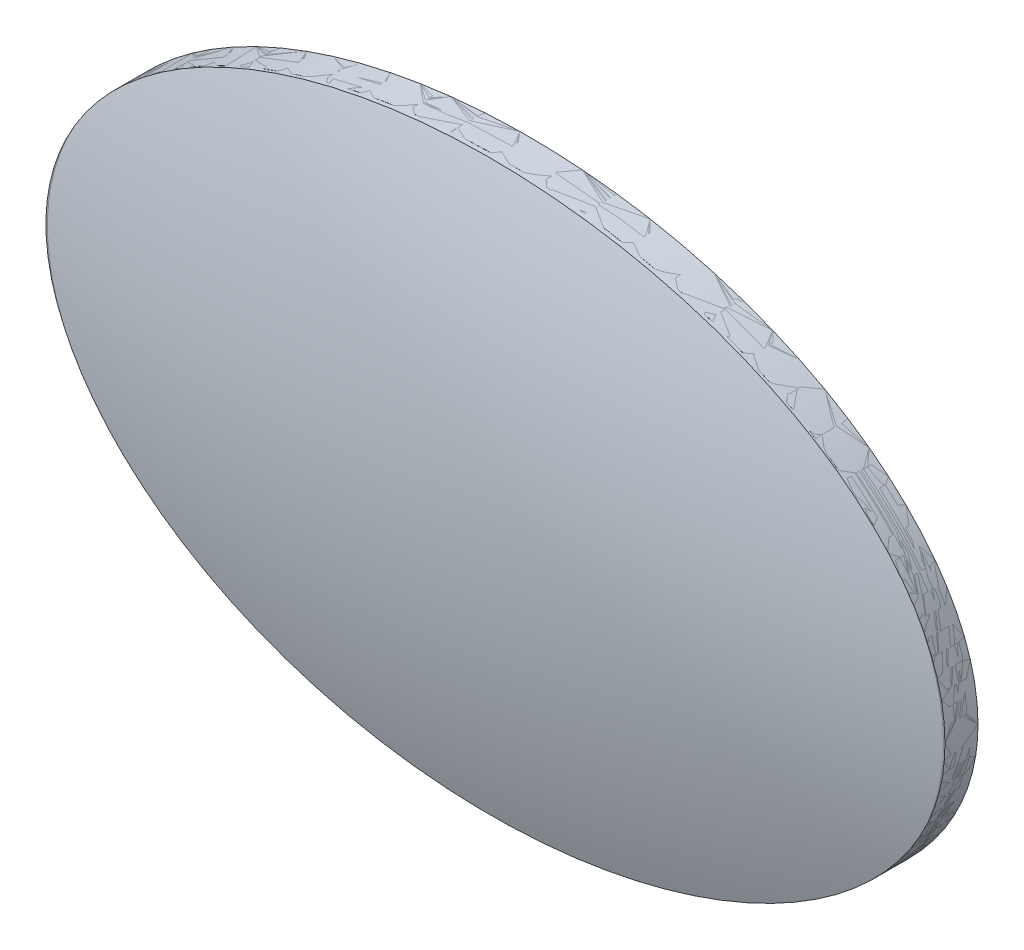
ISO-10303-21;
HEADER;
FILE_DESCRIPTION(('STEP AP214'),'2;1');
FILE_NAME('part.step','',(''),(''),'','','');
FILE_SCHEMA(('AUTOMOTIVE_DESIGN { 1 0 10303 214 1 1 1 1 }'));
ENDSEC;
DATA;
#1=APPLICATION_CONTEXT('core data for automotive mechanical design processes');
#2=APPLICATION_PROTOCOL_DEFINITION('international standard','automotive_design',2000,#1);
#3=PRODUCT_CONTEXT('',#1,'mechanical');
#4=PRODUCT('Part','Part','',(#3));
#5=PRODUCT_RELATED_PRODUCT_CATEGORY('part','',(#4));
#6=PRODUCT_DEFINITION_FORMATION('','',#4);
#7=PRODUCT_DEFINITION_CONTEXT('part definition',#1,'design');
#8=PRODUCT_DEFINITION('design','',#6,#7);
#9=PRODUCT_DEFINITION_SHAPE('','',#8);
#10=(LENGTH_UNIT() NAMED_UNIT(*) SI_UNIT(.MILLI.,.METRE.));
#11=(NAMED_UNIT(*) PLANE_ANGLE_UNIT() SI_UNIT($,.RADIAN.));
#12=(NAMED_UNIT(*) SI_UNIT($,.STERADIAN.) SOLID_ANGLE_UNIT());
#13=UNCERTAINTY_MEASURE_WITH_UNIT(LENGTH_MEASURE(1.E-05),#10,'distance_accuracy_value','');
#14=(GEOMETRIC_REPRESENTATION_CONTEXT(3) GLOBAL_UNCERTAINTY_ASSIGNED_CONTEXT((#13)) GLOBAL_UNIT_ASSIGNED_CONTEXT((#10,
#11,#12)) REPRESENTATION_CONTEXT('',''));
#15=CARTESIAN_POINT('',(0.,0.,0.));
#16=DIRECTION('',(0.,0.,1.));
#17=DIRECTION('',(1.,0.,0.));
#18=AXIS2_PLACEMENT_3D('',#15,#16,#17);
#19=CARTESIAN_POINT('',(0.,0.,0.));
#20=DIRECTION('',(0.,0.,1.));
#21=DIRECTION('',(1.,0.,0.));
#22=AXIS2_PLACEMENT_3D('',#19,#20,#21);
#23=PLANE('',#22);
#24=CARTESIAN_POINT('',(10.2557748774152,12.5325273636408,0.));
#25=DIRECTION('',(0.,0.,-1.));
#26=DIRECTION('',(1.,0.,0.));
#27=AXIS2_PLACEMENT_3D('',#24,#25,#26);
#28=CIRCLE('',#27,4.25000000000001);
#29=CARTESIAN_POINT('',(14.5057748774152,12.5325273636408,0.));
#30=VERTEX_POINT('',#29);
#31=EDGE_CURVE('E102',#30,#30,#28,.T.);
#32=ORIENTED_EDGE('',*,*,#31,.F.);
#33=EDGE_LOOP('',(#32));
#34=FACE_BOUND('',#33,.T.);
#35=CARTESIAN_POINT('',(10.2557748774152,-12.5325273636408,0.));
#36=DIRECTION('',(0.,0.,-1.));
#37=DIRECTION('',(1.,0.,0.));
#38=AXIS2_PLACEMENT_3D('',#35,#36,#37);
#39=CIRCLE('',#38,4.25000000000001);
#40=CARTESIAN_POINT('',(14.5057748774152,-12.5325273636408,0.));
#41=VERTEX_POINT('',#40);
#42=EDGE_CURVE('E106',#41,#41,#39,.T.);
#43=ORIENTED_EDGE('',*,*,#42,.F.);
#44=EDGE_LOOP('',(#43));
#45=FACE_BOUND('',#44,.T.);
#46=CARTESIAN_POINT('',(-10.2557748774152,-12.5325273636408,0.));
#47=DIRECTION('',(0.,0.,-1.));
#48=DIRECTION('',(-1.,0.,0.));
#49=AXIS2_PLACEMENT_3D('',#46,#47,#48);
#50=CIRCLE('',#49,4.25000000000001);
#51=CARTESIAN_POINT('',(-14.5057748774152,-12.5325273636408,0.));
#52=VERTEX_POINT('',#51);
#53=EDGE_CURVE('E110',#52,#52,#50,.T.);
#54=ORIENTED_EDGE('',*,*,#53,.F.);
#55=EDGE_LOOP('',(#54));
#56=FACE_BOUND('',#55,.T.);
#57=CARTESIAN_POINT('',(-10.2557748774152,12.5325273636408,0.));
#58=DIRECTION('',(0.,0.,-1.));
#59=DIRECTION('',(-1.,0.,0.));
#60=AXIS2_PLACEMENT_3D('',#57,#58,#59);
#61=CIRCLE('',#60,4.25000000000001);
#62=CARTESIAN_POINT('',(-14.5057748774152,12.5325273636408,0.));
#63=VERTEX_POINT('',#62);
#64=EDGE_CURVE('E81',#63,#63,#61,.T.);
#65=ORIENTED_EDGE('',*,*,#64,.F.);
#66=EDGE_LOOP('',(#65));
#67=FACE_BOUND('',#66,.T.);
#68=CARTESIAN_POINT('',(43.18,0.,-1.11022302462516E-13));
#69=CARTESIAN_POINT('',(43.18,3.4878693715103,-1.11022302462516E-13));
#70=CARTESIAN_POINT('',(41.0430846800186,10.4636081145309,-1.11022302462516E-13));
#71=CARTESIAN_POINT('',(31.5723963181923,19.6293858358663,-1.11022302462516E-13));
#72=CARTESIAN_POINT('',(17.1321357438557,25.842526194068,-1.11022302462516E-13));
#73=CARTESIAN_POINT('',(0.,28.036236902966,-1.11022302462516E-13));
#74=CARTESIAN_POINT('',(-17.1321357438557,25.842526194068,-1.11022302462516E-13));
#75=CARTESIAN_POINT('',(-31.5723963181923,19.6293858358664,-1.11022302462516E-13));
#76=CARTESIAN_POINT('',(-41.0430846800186,10.4636081145309,-1.11022302462516E-13));
#77=CARTESIAN_POINT('',(-44.2484576599907,0.,-1.11022302462516E-13));
#78=CARTESIAN_POINT('',(-41.0430846800186,-10.4636081145309,-1.11022302462516E-13));
#79=CARTESIAN_POINT('',(-31.5723963181923,-19.6293858358663,-1.11022302462516E-13));
#80=CARTESIAN_POINT('',(-17.1321357438557,-25.842526194068,-1.11022302462516E-13));
#81=CARTESIAN_POINT('',(0.,-28.036236902966,-1.11022302462516E-13));
#82=CARTESIAN_POINT('',(17.1321357438557,-25.842526194068,-1.11022302462516E-13));
#83=CARTESIAN_POINT('',(31.5723963181923,-19.6293858358664,-1.11022302462516E-13));
#84=CARTESIAN_POINT('',(41.0430846800186,-10.4636081145309,-1.11022302462516E-13));
#85=CARTESIAN_POINT('',(43.18,-3.48786937151031,-1.11022302462516E-13));
#86=CARTESIAN_POINT('',(43.18,0.,-1.11022302462516E-13));
#87=B_SPLINE_CURVE_WITH_KNOTS('',3,(#68,#69,#70,#71,#72,#73,#74,#75,#76,#77,#78,#79,#80,#81,#82,
#83,#84,#85,#86),.UNSPECIFIED.,.T.,.F.,(4,1,1,1,1,1,1,1,1,1,1,1,1,1,1,1,4),(0.,
0.392699081698724,0.785398163397448,1.17809724509617,1.5707963267949,1.96349540849362,
2.35619449019234,2.74889357189107,3.14159265358979,3.53429173528852,3.92699081698724,
4.31968989868597,4.71238898038469,5.10508806208341,5.49778714378214,5.89048622548086,
6.28318530717959),.UNSPECIFIED.);
#88=CARTESIAN_POINT('',(43.18,0.,-1.11022302462516E-13));
#89=VERTEX_POINT('',#88);
#90=EDGE_CURVE('E11',#89,#89,#87,.F.);
#91=ORIENTED_EDGE('',*,*,#90,.T.);
#92=EDGE_LOOP('',(#91));
#93=FACE_BOUND('',#92,.T.);
#94=ADVANCED_FACE('F47',(#34,#45,#56,#67,#93),#23,.F.);
#95=CARTESIAN_POINT('',(43.18,0.,524.129));
#96=CARTESIAN_POINT('',(43.18,3.4878693715103,524.129));
#97=CARTESIAN_POINT('',(41.0430846800186,10.4636081145309,524.129));
#98=CARTESIAN_POINT('',(31.5723963181923,19.6293858358663,524.129));
#99=CARTESIAN_POINT('',(17.1321357438557,25.842526194068,524.129));
#100=CARTESIAN_POINT('',(0.,28.036236902966,524.129));
#101=CARTESIAN_POINT('',(-17.1321357438557,25.842526194068,524.129));
#102=CARTESIAN_POINT('',(-31.5723963181923,19.6293858358664,524.129));
#103=CARTESIAN_POINT('',(-41.0430846800186,10.4636081145309,524.129));
#104=CARTESIAN_POINT('',(-44.2484576599907,0.,524.129));
#105=CARTESIAN_POINT('',(-41.0430846800186,-10.4636081145309,524.129));
#106=CARTESIAN_POINT('',(-31.5723963181923,-19.6293858358663,524.129));
#107=CARTESIAN_POINT('',(-17.1321357438557,-25.842526194068,524.129));
#108=CARTESIAN_POINT('',(0.,-28.036236902966,524.129));
#109=CARTESIAN_POINT('',(17.1321357438557,-25.842526194068,524.129));
#110=CARTESIAN_POINT('',(31.5723963181923,-19.6293858358664,524.129));
#111=CARTESIAN_POINT('',(41.0430846800186,-10.4636081145309,524.129));
#112=CARTESIAN_POINT('',(43.18,-3.48786937151031,524.129));
#113=CARTESIAN_POINT('',(43.18,0.,524.129));
#114=B_SPLINE_CURVE_WITH_KNOTS('',3,(#95,#96,#97,#98,#99,#100,#101,#102,#103,#104,#105,#106,
#107,#108,#109,#110,#111,#112,#113),.UNSPECIFIED.,.T.,.F.,(4,1,1,1,1,1,1,1,1,1,1,1,1,1,1,1,4),
(0.,0.392699081698724,0.785398163397448,1.17809724509617,1.5707963267949,1.96349540849362,
2.35619449019234,2.74889357189107,3.14159265358979,3.53429173528852,3.92699081698724,
4.31968989868597,4.71238898038469,5.10508806208341,5.49778714378214,5.89048622548086,
6.28318530717959),.UNSPECIFIED.);
#115=DIRECTION('',(0.,0.,-1.));
#116=VECTOR('',#115,1.);
#117=SURFACE_OF_LINEAR_EXTRUSION('',#114,#116);
#118=CARTESIAN_POINT('',(43.18,0.,3.14012137272277));
#119=CARTESIAN_POINT('',(43.1799960793895,0.523497298429098,3.13956618121582));
#120=CARTESIAN_POINT('',(43.1558816125278,1.04703680136278,3.13932088023274));
#121=CARTESIAN_POINT('',(43.0600986737315,2.08994920416573,3.1395394957686));
#122=CARTESIAN_POINT('',(42.9884075988169,2.60932000478603,3.14000374952373));
#123=CARTESIAN_POINT('',(42.7990078806969,3.64045529767473,3.14171461757246));
#124=CARTESIAN_POINT('',(42.6812230875402,4.15220574078369,3.1429625285947));
#125=CARTESIAN_POINT('',(42.4021858886492,5.16360691972781,3.14628993840479));
#126=CARTESIAN_POINT('',(42.2409372548889,5.66325870143653,3.14836936503781));
#127=CARTESIAN_POINT('',(41.8794213623204,6.64394234188926,3.15336389289247));
#128=CARTESIAN_POINT('',(41.6794537601004,7.12508519202735,3.15627265254574));
#129=CARTESIAN_POINT('',(41.243057557415,8.0705515808909,3.16292886739584));
#130=CARTESIAN_POINT('',(41.0066236550454,8.53487266172565,3.16667644458575));
#131=CARTESIAN_POINT('',(40.5007447877165,9.44508105594325,3.17498704936712));
#132=CARTESIAN_POINT('',(40.2313011995489,9.8909691371061,3.17955004295224));
#133=CARTESIAN_POINT('',(39.6627847730515,10.7634058162152,3.18943651251083));
#134=CARTESIAN_POINT('',(39.3637076507428,11.1899516049081,3.19476009848881));
#135=CARTESIAN_POINT('',(38.5580062029234,12.2658531464232,3.20922201250673));
#136=CARTESIAN_POINT('',(38.0317922166512,12.9006012527261,3.21877901860847));
#137=CARTESIAN_POINT('',(36.9258342156807,14.121638520547,3.23875780329732));
#138=CARTESIAN_POINT('',(36.346062509665,14.7079023136404,3.2491800289495));
#139=CARTESIAN_POINT('',(35.1409429849121,15.8342455298355,3.2705983560261));
#140=CARTESIAN_POINT('',(34.5154969203899,16.3742196203311,3.28159567915935));
#141=CARTESIAN_POINT('',(33.5497494306548,17.1493478067079,3.29838060751952));
#142=CARTESIAN_POINT('',(33.2232277996901,17.4019248742899,3.30402390082243));
#143=CARTESIAN_POINT('',(32.5616822331362,17.8957152532383,3.31539933546689));
#144=CARTESIAN_POINT('',(32.2266583300301,18.1369286080097,3.32113147646896));
#145=CARTESIAN_POINT('',(31.5457548485907,18.6103026641815,3.33273018369989));
#146=CARTESIAN_POINT('',(31.1998041975208,18.8423609283927,3.33859749870571));
#147=CARTESIAN_POINT('',(30.50063626376,19.2952489318096,3.35041786913552));
#148=CARTESIAN_POINT('',(30.1474189662646,19.5160786481361,3.35637092473418));
#149=CARTESIAN_POINT('',(29.4342455787224,19.9469588112041,3.36830393033071));
#150=CARTESIAN_POINT('',(29.0742863580127,20.1570040717806,3.37428389179153));
#151=CARTESIAN_POINT('',(28.348424271164,20.5665306465456,3.38621068453701));
#152=CARTESIAN_POINT('',(27.9825213949436,20.7660119428132,3.39215751576545));
#153=CARTESIAN_POINT('',(26.8765966414131,21.3491425373958,3.40987824467243));
#154=CARTESIAN_POINT('',(26.1284218085597,21.7174406082886,3.42153130618856));
#155=CARTESIAN_POINT('',(24.6133642483417,22.4154918959211,3.44424349046189));
#156=CARTESIAN_POINT('',(23.846460972147,22.7452002428522,3.45530191389348));
#157=CARTESIAN_POINT('',(22.2978687832281,23.3672010160078,3.4766385624112));
#158=CARTESIAN_POINT('',(21.5161835954199,23.6595027279008,3.48691698086369));
#159=CARTESIAN_POINT('',(19.9402377247293,24.2080936717413,3.50661097308783));
#160=CARTESIAN_POINT('',(19.1459764184381,24.4643811121732,3.51602650392739));
#161=CARTESIAN_POINT('',(17.777119544098,24.8731509095159,3.53139674751223));
#162=CARTESIAN_POINT('',(17.205088167832,25.0342810684865,3.53756763714489));
#163=CARTESIAN_POINT('',(16.0563464949149,25.3390122676278,3.54947543846367));
#164=CARTESIAN_POINT('',(15.4796360382055,25.4826127054367,3.55521233523423));
#165=CARTESIAN_POINT('',(14.3220325994742,25.7528339678191,3.56616451358556));
#166=CARTESIAN_POINT('',(13.7411381907681,25.8794486805402,3.57137960723901));
#167=CARTESIAN_POINT('',(12.5759897328035,26.1160427537199,3.58121985326837));
#168=CARTESIAN_POINT('',(11.9917357082488,26.2260222363385,3.58584500997642));
#169=CARTESIAN_POINT('',(10.2345480519244,26.5315642734104,3.59875717667005));
#170=CARTESIAN_POINT('',(9.05728352846278,26.7027084730191,3.60607997060835));
#171=CARTESIAN_POINT('',(6.69334077609811,26.9818548347877,3.61794702090617));
#172=CARTESIAN_POINT('',(5.50665018876198,27.089751989908,3.62248665704813));
#173=CARTESIAN_POINT('',(3.72381923728207,27.2043634931492,3.62722654935537));
#174=CARTESIAN_POINT('',(3.1291160852939,27.2346945086887,3.62846157312684));
#175=CARTESIAN_POINT('',(1.93910083048948,27.2796005515228,3.63026640956345));
#176=CARTESIAN_POINT('',(1.34378872965934,27.2941756300428,3.6308362243913));
#177=CARTESIAN_POINT('',(0.153011237565753,27.3074612849501,3.63135728802861));
#178=CARTESIAN_POINT('',(-0.442454147561897,27.3061724199407,3.63130855861834));
#179=CARTESIAN_POINT('',(-1.63314019864294,27.2877522988844,3.63058458809461));
#180=CARTESIAN_POINT('',(-2.22836086377794,27.2706209902821,3.62990934490276));
#181=CARTESIAN_POINT('',(-3.42738383136918,27.2202231439051,3.62787271495467));
#182=CARTESIAN_POINT('',(-4.03117583837073,27.1867101381939,3.62650083441027));
#183=CARTESIAN_POINT('',(-5.23761933105075,27.103443069618,3.6230461603013));
#184=CARTESIAN_POINT('',(-5.84027081518859,27.0536889848307,3.62096336577713));
#185=CARTESIAN_POINT('',(-7.64599897069816,26.8799754212912,3.61363025055221));
#186=CARTESIAN_POINT('',(-8.84682611815587,26.731565605012,3.6072952365258));
#187=CARTESIAN_POINT('',(-11.2386644057959,26.3681950344377,3.59183718745053));
#188=CARTESIAN_POINT('',(-12.4296725442218,26.1532146508548,3.5827133300814));
#189=CARTESIAN_POINT('',(-14.7940128048203,25.6546815564713,3.56210616279538));
#190=CARTESIAN_POINT('',(-15.9673845479706,25.371319164083,3.55062941447338));
#191=CARTESIAN_POINT('',(-17.7121558195635,24.8918462744873,3.53210317064298));
#192=CARTESIAN_POINT('',(-18.291148843547,24.7229674762338,3.52570984865086));
#193=CARTESIAN_POINT('',(-19.4434667647192,24.3667861877237,3.51246097167562));
#194=CARTESIAN_POINT('',(-20.0167915839718,24.1794834445304,3.50560541034695));
#195=CARTESIAN_POINT('',(-21.1565874109098,23.7862067075708,3.49144873371886));
#196=CARTESIAN_POINT('',(-21.7230626570271,23.5802450088174,3.48414791283775));
#197=CARTESIAN_POINT('',(-22.8486414937446,23.1490902042436,3.46912323693471));
#198=CARTESIAN_POINT('',(-23.4077448145433,22.9238963967998,3.46139936648282));
#199=CARTESIAN_POINT('',(-24.8489815907209,22.3133298555901,3.44084810942521));
#200=CARTESIAN_POINT('',(-25.7247091489528,21.9125868064044,3.42772660646896));
#201=CARTESIAN_POINT('',(-27.0183337803349,21.2715815376084,3.40757619385684));
#202=CARTESIAN_POINT('',(-27.4462201411444,21.0512612534532,3.40078126346996));
#203=CARTESIAN_POINT('',(-28.294641657437,20.5968409359492,3.38709898406505));
#204=CARTESIAN_POINT('',(-28.7151768079857,20.3627408933512,3.38021163498499));
#205=CARTESIAN_POINT('',(-29.5477769094427,19.8804356168037,3.36642109225291));
#206=CARTESIAN_POINT('',(-29.959846397822,19.6322382224181,3.35951790941658));
#207=CARTESIAN_POINT('',(-30.7747265233034,19.121052050745,3.34579762151049));
#208=CARTESIAN_POINT('',(-31.1775370799061,18.8580631449252,3.33898051718934));
#209=CARTESIAN_POINT('',(-31.972804952272,18.3169818395393,3.32546432332479));
#210=CARTESIAN_POINT('',(-32.3652639994489,18.0388919898947,3.31876521410837));
#211=CARTESIAN_POINT('',(-33.1387817082669,17.4673323759701,3.30548413614316));
#212=CARTESIAN_POINT('',(-33.5198408819129,17.1738633040543,3.29890216213884));
#213=CARTESIAN_POINT('',(-34.4733163916924,16.4072452478923,3.28232601823772));
#214=CARTESIAN_POINT('',(-35.0370572080051,15.9232013869467,3.27242353557438));
#215=CARTESIAN_POINT('',(-36.1292218863815,14.9166086317452,3.25304955716509));
#216=CARTESIAN_POINT('',(-36.6576438194121,14.3940576375934,3.24357808496891));
#217=CARTESIAN_POINT('',(-37.6719471953172,13.3102508390776,3.22529273229288));
#218=CARTESIAN_POINT('',(-38.1578822468656,12.7490454550028,3.21647802526596));
#219=CARTESIAN_POINT('',(-39.0798067314075,11.5869887005214,3.19983196507841));
#220=CARTESIAN_POINT('',(-39.5158152444313,10.9861526147485,3.19200023615011));
#221=CARTESIAN_POINT('',(-40.2216172899152,9.90774035909775,3.17971341555776));
#222=CARTESIAN_POINT('',(-40.5050427075442,9.4390740650527,3.17491109522897));
#223=CARTESIAN_POINT('',(-41.0353076618379,8.48142541891182,3.16621102558722));
#224=CARTESIAN_POINT('',(-41.2821510870367,7.99244523319417,3.16231318010688));
#225=CARTESIAN_POINT('',(-41.7351420791859,6.99632014347942,3.15544705696969));
#226=CARTESIAN_POINT('',(-41.9413168072906,6.48918763202172,3.15247815812075));
#227=CARTESIAN_POINT('',(-42.3093411218578,5.45893371619839,3.14746817308366));
#228=CARTESIAN_POINT('',(-42.4711899157455,4.93581202612229,3.14542710348523));
#229=CARTESIAN_POINT('',(-42.7018341669963,4.05085781625193,3.14276474970973));
#230=CARTESIAN_POINT('',(-42.7837391443601,3.69239689357974,3.14189736460546));
#231=CARTESIAN_POINT('',(-42.9251385040852,2.97103609084432,3.14055036170013));
#232=CARTESIAN_POINT('',(-42.9846322010865,2.6081360753794,3.14007075575724));
#233=CARTESIAN_POINT('',(-43.0805150233957,1.87930462540415,3.13947707089009));
#234=CARTESIAN_POINT('',(-43.1169048154667,1.51337327868479,3.13936298141688));
#235=CARTESIAN_POINT('',(-43.1661285614349,0.780030764602364,3.13947317590302));
#236=CARTESIAN_POINT('',(-43.1789693394784,0.412620056875522,3.13969736180097));
#237=CARTESIAN_POINT('',(-43.1809111932646,-0.322278306930669,3.14045110233015));
#238=CARTESIAN_POINT('',(-43.1700116165077,-0.689765964847403,3.14098066535433));
#239=CARTESIAN_POINT('',(-43.1246560437348,-1.42321508040408,3.14237077665563));
#240=CARTESIAN_POINT('',(-43.0902030311822,-1.78917672543467,3.14323128300684));
#241=CARTESIAN_POINT('',(-42.9830628990487,-2.63773121771201,3.14564850974722));
#242=CARTESIAN_POINT('',(-42.9015445585686,-3.11923093619424,3.14734098655212));
#243=CARTESIAN_POINT('',(-42.6993333185599,-4.07380678233449,3.15139577793605));
#244=CARTESIAN_POINT('',(-42.5786446881254,-4.54688382203959,3.15375801951517));
#245=CARTESIAN_POINT('',(-42.300256800576,-5.48204461621355,3.15917882666732));
#246=CARTESIAN_POINT('',(-42.1425523834519,-5.94412682810084,3.16223748931982));
#247=CARTESIAN_POINT('',(-41.7926463706519,-6.85512874432163,3.16906032196859));
#248=CARTESIAN_POINT('',(-41.6004373541257,-7.30404559299162,3.17282464373758));
#249=CARTESIAN_POINT('',(-41.2532496153764,-8.04066858642353,3.17968640797797));
#250=CARTESIAN_POINT('',(-41.1070115774867,-8.33254368906281,3.18259205718253));
#251=CARTESIAN_POINT('',(-40.801231722495,-8.90915834077922,3.18870662823465));
#252=CARTESIAN_POINT('',(-40.6416929817041,-9.19389952015188,3.19191547997747));
#253=CARTESIAN_POINT('',(-40.3100721806455,-9.75608855932651,3.19862902365296));
#254=CARTESIAN_POINT('',(-40.1379860395197,-10.0335340060195,3.20213381189375));
#255=CARTESIAN_POINT('',(-39.7821356970684,-10.580843142379,3.20942352690506));
#256=CARTESIAN_POINT('',(-39.5983707346758,-10.8507063362812,3.21320847193505));
#257=CARTESIAN_POINT('',(-39.2197649979098,-11.3832035866766,3.22101271166292));
#258=CARTESIAN_POINT('',(-39.0249065155827,-11.6458250322095,3.22503238131691));
#259=CARTESIAN_POINT('',(-38.6252237967411,-12.1633381312074,3.23325864368795));
#260=CARTESIAN_POINT('',(-38.4203998037647,-12.4182299733225,3.23746523183686));
#261=CARTESIAN_POINT('',(-37.7921087949917,-13.1713487373144,3.25031132064465));
#262=CARTESIAN_POINT('',(-37.3547919857238,-13.6580618123638,3.25917778673514));
#263=CARTESIAN_POINT('',(-36.2388685176258,-14.8193376936933,3.28149060468149));
#264=CARTESIAN_POINT('',(-35.54223333174,-15.4766326988895,3.29515804580538));
#265=CARTESIAN_POINT('',(-34.4567570247141,-16.4151157009157,3.3159937791944));
#266=CARTESIAN_POINT('',(-34.0880628337372,-16.7201164786593,3.32299690250134));
#267=CARTESIAN_POINT('',(-33.3383744319356,-17.3146497378939,3.33709708233648));
#268=CARTESIAN_POINT('',(-32.9573805681191,-17.6041826551657,3.34419413621132));
#269=CARTESIAN_POINT('',(-32.1838482611441,-18.1683942009789,3.35847391512166));
#270=CARTESIAN_POINT('',(-31.7912959332768,-18.4430537367574,3.36565673647296));
#271=CARTESIAN_POINT('',(-30.9961309001597,-18.9773889224695,3.38010598020071));
#272=CARTESIAN_POINT('',(-30.5935181603409,-19.2370645209061,3.38737240286437));
#273=CARTESIAN_POINT('',(-29.7792584461301,-19.741833102713,3.40194260477741));
#274=CARTESIAN_POINT('',(-29.3676113931149,-19.9869259591046,3.40924638435147));
#275=CARTESIAN_POINT('',(-28.536297568485,-20.4630646613288,3.42379233285794));
#276=CARTESIAN_POINT('',(-28.1166307559494,-20.6941104354609,3.43103450147571));
#277=CARTESIAN_POINT('',(-26.8306437278519,-21.3754873695845,3.45283672023064));
#278=CARTESIAN_POINT('',(-25.9529166561902,-21.8044660582782,3.46718875719301));
#279=CARTESIAN_POINT('',(-24.1732647026838,-22.609509795881,3.4949125125061));
#280=CARTESIAN_POINT('',(-23.2713297694575,-22.9855524474365,3.50828381476665));
#281=CARTESIAN_POINT('',(-21.4479415956479,-23.6871305106681,3.53381534685038));
#282=CARTESIAN_POINT('',(-20.5264863073192,-24.0126605933019,3.54597544884435));
#283=CARTESIAN_POINT('',(-18.6662581666211,-24.6155247522756,3.56901835955398));
#284=CARTESIAN_POINT('',(-17.727458724023,-24.8927766026811,3.57989897906054));
#285=CARTESIAN_POINT('',(-15.8372991167776,-25.3996170871692,3.60040103418623));
#286=CARTESIAN_POINT('',(-14.8859414628984,-25.6292150996746,3.6100227174299));
#287=CARTESIAN_POINT('',(-12.9733358756779,-26.0429423241923,3.6276639586702));
#288=CARTESIAN_POINT('',(-12.0120869418844,-26.227066888761,3.63568335289489));
#289=CARTESIAN_POINT('',(-9.81234402527306,-26.5967178546049,3.65187375152059));
#290=CARTESIAN_POINT('',(-8.57147611989573,-26.768243211936,3.65946026991055));
#291=CARTESIAN_POINT('',(-6.0818333631037,-27.0412609485199,3.6714284650373));
#292=CARTESIAN_POINT('',(-4.83305679376401,-27.1427375456301,3.67580941956669));
#293=CARTESIAN_POINT('',(-2.33156330973243,-27.2761184056311,3.68145784864721));
#294=CARTESIAN_POINT('',(-1.07884577123,-27.3080110352579,3.68272480259451));
#295=CARTESIAN_POINT('',(1.42631822279663,-27.3015378912039,3.68245548070323));
#296=CARTESIAN_POINT('',(2.6787646912485,-27.2631771024875,3.68091940375905));
#297=CARTESIAN_POINT('',(5.17936210346855,-27.1169078347171,3.67470310519833));
#298=CARTESIAN_POINT('',(6.42751371876603,-27.0090107759296,3.67002339986924));
#299=CARTESIAN_POINT('',(8.91550045792759,-26.7230409833228,3.6574675331211));
#300=CARTESIAN_POINT('',(10.1553375814213,-26.5449857866197,3.64959217049157));
#301=CARTESIAN_POINT('',(12.3216807759355,-26.1689125406423,3.63315189337985));
#302=CARTESIAN_POINT('',(13.2508948594227,-25.9863403989879,3.62522300600743));
#303=CARTESIAN_POINT('',(15.099828598293,-25.5784583738352,3.6078936684606));
#304=CARTESIAN_POINT('',(16.0195493358935,-25.3531534197943,3.59849338804104));
#305=CARTESIAN_POINT('',(17.8470668957758,-24.8578610712957,3.57852112877602));
#306=CARTESIAN_POINT('',(18.7548616222152,-24.5878659335584,3.5679489469852));
#307=CARTESIAN_POINT('',(20.5538023166141,-24.0026841880213,3.54560704654524));
#308=CARTESIAN_POINT('',(21.4449777754026,-23.6875884199235,3.53383974856026));
#309=CARTESIAN_POINT('',(23.2091129684011,-23.0101491413979,3.50917144889923));
#310=CARTESIAN_POINT('',(24.0820743615533,-22.6478099558976,3.49627055103447));
#311=CARTESIAN_POINT('',(25.8055477238843,-21.8736977935185,3.46953875941045));
#312=CARTESIAN_POINT('',(26.6560685106257,-21.4619445966216,3.45570823873961));
#313=CARTESIAN_POINT('',(27.8893905477117,-20.8164185599927,3.43491544730408));
#314=CARTESIAN_POINT('',(28.2829059732412,-20.6029428768433,3.42816682738302));
#315=CARTESIAN_POINT('',(29.0631028391239,-20.1638149181528,3.4146021522214));
#316=CARTESIAN_POINT('',(29.44978431964,-19.9381627142045,3.40778609737751));
#317=CARTESIAN_POINT('',(30.2155068140471,-19.4742821572797,3.39415822737863));
#318=CARTESIAN_POINT('',(30.5945482494368,-19.2360545007254,3.38734641200995));
#319=CARTESIAN_POINT('',(31.3441511860673,-18.7466014911769,3.37379466480845));
#320=CARTESIAN_POINT('',(31.7147127149566,-18.49537618057,3.36705473274131));
#321=CARTESIAN_POINT('',(32.446300660043,-17.9798924302954,3.3536448252891));
#322=CARTESIAN_POINT('',(32.8073334473967,-17.7156430561811,3.34697480505558));
#323=CARTESIAN_POINT('',(33.519168700678,-17.1737415050669,3.33371018848287));
#324=CARTESIAN_POINT('',(33.8699709587764,-16.8960890560926,3.32711559367756));
#325=CARTESIAN_POINT('',(34.9054260291801,-16.0427444438485,3.30746401011687));
#326=CARTESIAN_POINT('',(35.5734296322255,-15.4464534246047,3.29453368923692));
#327=CARTESIAN_POINT('',(36.6868939169282,-14.3610657039732,3.27256806410522));
#328=CARTESIAN_POINT('',(37.1448552270411,-13.8847372167844,3.2633987510549));
#329=CARTESIAN_POINT('',(38.0259907752714,-12.9007561458335,3.24555695935866));
#330=CARTESIAN_POINT('',(38.4491665442293,-12.393104942243,3.23688445885414));
#331=CARTESIAN_POINT('',(39.2543680216493,-11.346786668536,3.22030729783813));
#332=CARTESIAN_POINT('',(39.6364331041791,-10.8081500477428,3.21240190335083));
#333=CARTESIAN_POINT('',(40.352633946511,-9.69986723898629,3.19774339686063));
#334=CARTESIAN_POINT('',(40.6867838447474,-9.13023026708529,3.1909899448397));
#335=CARTESIAN_POINT('',(41.2345811745766,-8.08720990994162,3.18004594856382));
#336=CARTESIAN_POINT('',(41.4587123389122,-7.6193223371646,3.17561623865555));
#337=CARTESIAN_POINT('',(41.8697924168805,-6.66737842293312,3.1675482591283));
#338=CARTESIAN_POINT('',(42.056740499677,-6.18332172047025,3.16391000719386));
#339=CARTESIAN_POINT('',(42.3898596735651,-5.20243132517827,3.15743389332226));
#340=CARTESIAN_POINT('',(42.5361135607723,-4.70562585534425,3.15459440609264));
#341=CARTESIAN_POINT('',(42.7854653136222,-3.70146391999024,3.14968530290061));
#342=CARTESIAN_POINT('',(42.8885826907405,-3.1941123339262,3.14761533891526));
#343=CARTESIAN_POINT('',(43.0389186184136,-2.23968097478108,3.14442527133452));
#344=CARTESIAN_POINT('',(43.0917150867222,-1.79347512926497,3.14321590964431));
#345=CARTESIAN_POINT('',(43.1622613628097,-0.898190288464245,3.14130205473386));
#346=CARTESIAN_POINT('',(43.1800033635093,-0.449110675491707,3.1405976740016));
#347=CARTESIAN_POINT('',(43.18,0.,3.14012137272277));
#348=B_SPLINE_CURVE_WITH_KNOTS('',3,(#118,#119,#120,#121,#122,#123,#124,#125,#126,#127,#128,
#129,#130,#131,#132,#133,#134,#135,#136,#137,#138,#139,#140,#141,#142,#143,#144,#145,#146,#147,
#148,#149,#150,#151,#152,#153,#154,#155,#156,#157,#158,#159,#160,#161,#162,#163,#164,#165,#166,
#167,#168,#169,#170,#171,#172,#173,#174,#175,#176,#177,#178,#179,#180,#181,#182,#183,#184,#185,
#186,#187,#188,#189,#190,#191,#192,#193,#194,#195,#196,#197,#198,#199,#200,#201,#202,#203,#204,
#205,#206,#207,#208,#209,#210,#211,#212,#213,#214,#215,#216,#217,#218,#219,#220,#221,#222,#223,
#224,#225,#226,#227,#228,#229,#230,#231,#232,#233,#234,#235,#236,#237,#238,#239,#240,#241,#242,
#243,#244,#245,#246,#247,#248,#249,#250,#251,#252,#253,#254,#255,#256,#257,#258,#259,#260,#261,
#262,#263,#264,#265,#266,#267,#268,#269,#270,#271,#272,#273,#274,#275,#276,#277,#278,#279,#280,
#281,#282,#283,#284,#285,#286,#287,#288,#289,#290,#291,#292,#293,#294,#295,#296,#297,#298,#299,
#300,#301,#302,#303,#304,#305,#306,#307,#308,#309,#310,#311,#312,#313,#314,#315,#316,#317,#318,
#319,#320,#321,#322,#323,#324,#325,#326,#327,#328,#329,#330,#331,#332,#333,#334,#335,#336,#337,
#338,#339,#340,#341,#342,#343,#344,#345,#346,#347),.UNSPECIFIED.,.T.,.F.,(4,2,2,2,2,2,2,2,2,2,2,
2,2,2,2,2,2,2,2,2,2,2,2,2,2,2,2,2,2,2,2,2,2,2,2,2,2,2,2,2,2,2,2,2,2,2,2,2,2,2,2,2,2,2,2,2,2,2,2,
2,2,2,2,2,2,2,2,2,2,2,2,2,2,2,2,2,2,2,2,2,2,2,2,2,2,2,2,2,2,2,2,2,2,2,2,2,2,2,2,2,2,2,2,2,2,2,2,
2,2,2,2,2,2,2,4),(0.,1.57002095980417,3.14078834905544,4.71416178274763,6.28739871644931,
7.84891434642369,9.41065722249781,10.9723349824435,12.5342388370108,15.004038071384,
17.475121507712,19.9516863913631,21.1900372619628,22.4283834021464,23.6780061525835,
24.9276314491533,26.1778521584305,27.4280749885202,29.9287414046266,32.4322871516993,
34.9352102184175,37.4382577480104,39.2209677354737,41.0037389637562,42.7871499631102,
44.5705478654301,48.1376348663664,51.7106275351037,53.4968860956736,55.2831388487724,
57.069328704274,58.8555244852673,60.6694621272787,62.4834022178073,66.1113520506096,
69.740372656801,73.3594072797199,75.1686100176409,76.977837597019,78.7858815682914,
80.5939915285924,83.4814666785814,84.9252452606611,86.3690248118345,87.8120091892394,
89.2550061075473,90.6977601168204,92.1404492298069,94.3679915199246,96.5956553738376,
98.8204665949757,101.044424719803,102.686168355102,104.327737353601,105.968206267549,
107.608704512177,108.711165146882,109.813659493236,110.916122020902,112.01826502117,
113.120438314031,114.222472022816,115.685763274692,117.148895098818,118.61223100512,
120.075882006657,121.054978361369,122.033848886432,123.013039207215,123.992293403897,
124.973157119191,125.953996876062,127.915518386568,130.784522641018,132.219872501495,
133.655181902062,135.092292119322,136.529407275389,137.966534943252,139.403669946016,
142.332726691954,145.263019027195,148.193620296443,151.129165063368,154.064131557046,
156.999397883982,160.75533132473,164.512110709749,168.269518116715,172.026658920052,
175.783182827796,179.538768329146,182.378895402172,185.218695050466,188.058987254919,
190.893637133159,193.7280276936,196.561287433998,197.904334749495,199.247374169315,
200.590339290178,201.933300031695,203.275338839464,204.617404891267,207.30043221599,
209.281535910836,211.26255237464,213.241654292515,215.220171025602,216.775191529534,
218.33024677567,219.882114588723,221.433279701055,222.779907832319,224.126835841135),.UNSPECIFIED.);
#349=CARTESIAN_POINT('',(43.18,0.,3.14012137272277));
#350=VERTEX_POINT('',#349);
#351=EDGE_CURVE('E53',#350,#350,#348,.T.);
#352=ORIENTED_EDGE('',*,*,#351,.F.);
#353=EDGE_LOOP('',(#352));
#354=FACE_BOUND('',#353,.T.);
#355=ORIENTED_EDGE('',*,*,#90,.F.);
#356=EDGE_LOOP('',(#355));
#357=FACE_BOUND('',#356,.T.);
#358=ADVANCED_FACE('F86',(#354,#357),#117,.F.);
#359=CARTESIAN_POINT('',(0.,111.125,-168.171923244));
#360=CARTESIAN_POINT('',(-25.6850602997289,111.125,-168.171923244));
#361=CARTESIAN_POINT('',(-68.9857561921782,107.923102763251,-168.171923244));
#362=CARTESIAN_POINT('',(-144.491866472977,82.8285514234002,-168.171923244));
#363=CARTESIAN_POINT('',(-194.510279111114,0.,-168.171923244));
#364=CARTESIAN_POINT('',(-144.662239102374,-82.8285514234003,-168.171923244));
#365=CARTESIAN_POINT('',(-68.463431094289,-107.923102763251,-168.171923244));
#366=CARTESIAN_POINT('',(-26.812062356272,-111.125,-168.171923244));
#367=CARTESIAN_POINT('',(0.,-111.125,-168.171923244));
#368=B_SPLINE_CURVE_WITH_KNOTS('',3,(#359,#360,#361,#362,#363,#364,#365,#366,#367),
.UNSPECIFIED.,.F.,.F.,(4,1,1,1,1,1,4),(0.,0.152479170581432,0.306817144524869,0.5,
0.693182855475131,0.847520829418568,1.),.UNSPECIFIED.);
#369=CARTESIAN_POINT('',(0.,104.775,-168.171923244));
#370=DIRECTION('',(0.,-1.,0.));
#371=AXIS1_PLACEMENT('',#369,#370);
#372=SURFACE_OF_REVOLUTION('',#368,#371);
#373=ORIENTED_EDGE('',*,*,#351,.T.);
#374=EDGE_LOOP('',(#373));
#375=FACE_BOUND('',#374,.T.);
#376=ADVANCED_FACE('F49',(#375),#372,.T.);
#377=CARTESIAN_POINT('',(-10.2557748774152,12.5325273636408,3.5));
#378=DIRECTION('',(0.,0.,-1.));
#379=DIRECTION('',(-1.,0.,0.));
#380=AXIS2_PLACEMENT_3D('',#377,#378,#379);
#381=CYLINDRICAL_SURFACE('',#380,4.25000000000001);
#382=CARTESIAN_POINT('',(-10.2557748774152,12.5325273636408,3.5));
#383=DIRECTION('',(0.,0.,-1.));
#384=DIRECTION('',(-1.,0.,0.));
#385=AXIS2_PLACEMENT_3D('',#382,#383,#384);
#386=CIRCLE('',#385,4.25000000000001);
#387=CARTESIAN_POINT('',(-14.5057748774152,12.5325273636408,3.5));
#388=VERTEX_POINT('',#387);
#389=EDGE_CURVE('E64',#388,#388,#386,.T.);
#390=ORIENTED_EDGE('',*,*,#389,.F.);
#391=EDGE_LOOP('',(#390));
#392=FACE_BOUND('',#391,.T.);
#393=ORIENTED_EDGE('',*,*,#64,.T.);
#394=EDGE_LOOP('',(#393));
#395=FACE_BOUND('',#394,.T.);
#396=ADVANCED_FACE('F91',(#392,#395),#381,.F.);
#397=CARTESIAN_POINT('',(-10.2557748774152,12.5325273636408,3.5));
#398=DIRECTION('',(0.,0.,-1.));
#399=DIRECTION('',(-1.,0.,0.));
#400=AXIS2_PLACEMENT_3D('',#397,#398,#399);
#401=PLANE('',#400);
#402=ORIENTED_EDGE('',*,*,#389,.T.);
#403=EDGE_LOOP('',(#402));
#404=FACE_BOUND('',#403,.T.);
#405=ADVANCED_FACE('F147',(#404),#401,.T.);
#406=CARTESIAN_POINT('',(-10.2557748774152,-12.5325273636408,3.5));
#407=DIRECTION('',(0.,0.,-1.));
#408=DIRECTION('',(-1.,0.,0.));
#409=AXIS2_PLACEMENT_3D('',#406,#407,#408);
#410=CYLINDRICAL_SURFACE('',#409,4.25000000000001);
#411=CARTESIAN_POINT('',(-10.2557748774152,-12.5325273636408,3.5));
#412=DIRECTION('',(0.,0.,-1.));
#413=DIRECTION('',(-1.,0.,0.));
#414=AXIS2_PLACEMENT_3D('',#411,#412,#413);
#415=CIRCLE('',#414,4.25000000000001);
#416=CARTESIAN_POINT('',(-14.5057748774152,-12.5325273636408,3.5));
#417=VERTEX_POINT('',#416);
#418=EDGE_CURVE('E114',#417,#417,#415,.T.);
#419=ORIENTED_EDGE('',*,*,#418,.F.);
#420=EDGE_LOOP('',(#419));
#421=FACE_BOUND('',#420,.T.);
#422=ORIENTED_EDGE('',*,*,#53,.T.);
#423=EDGE_LOOP('',(#422));
#424=FACE_BOUND('',#423,.T.);
#425=ADVANCED_FACE('F149',(#421,#424),#410,.F.);
#426=CARTESIAN_POINT('',(-10.2557748774152,-12.5325273636408,3.5));
#427=DIRECTION('',(0.,0.,-1.));
#428=DIRECTION('',(-1.,0.,0.));
#429=AXIS2_PLACEMENT_3D('',#426,#427,#428);
#430=PLANE('',#429);
#431=ORIENTED_EDGE('',*,*,#418,.T.);
#432=EDGE_LOOP('',(#431));
#433=FACE_BOUND('',#432,.T.);
#434=ADVANCED_FACE('F154',(#433),#430,.T.);
#435=CARTESIAN_POINT('',(10.2557748774152,-12.5325273636408,3.5));
#436=DIRECTION('',(0.,0.,-1.));
#437=DIRECTION('',(-1.,0.,0.));
#438=AXIS2_PLACEMENT_3D('',#435,#436,#437);
#439=CYLINDRICAL_SURFACE('',#438,4.25000000000001);
#440=CARTESIAN_POINT('',(10.2557748774152,-12.5325273636408,3.5));
#441=DIRECTION('',(0.,0.,-1.));
#442=DIRECTION('',(1.,0.,0.));
#443=AXIS2_PLACEMENT_3D('',#440,#441,#442);
#444=CIRCLE('',#443,4.25000000000001);
#445=CARTESIAN_POINT('',(14.5057748774152,-12.5325273636408,3.5));
#446=VERTEX_POINT('',#445);
#447=EDGE_CURVE('E120',#446,#446,#444,.T.);
#448=ORIENTED_EDGE('',*,*,#447,.F.);
#449=EDGE_LOOP('',(#448));
#450=FACE_BOUND('',#449,.T.);
#451=ORIENTED_EDGE('',*,*,#42,.T.);
#452=EDGE_LOOP('',(#451));
#453=FACE_BOUND('',#452,.T.);
#454=ADVANCED_FACE('F142',(#450,#453),#439,.F.);
#455=CARTESIAN_POINT('',(10.2557748774152,-12.5325273636408,3.5));
#456=DIRECTION('',(0.,0.,1.));
#457=DIRECTION('',(1.,0.,0.));
#458=AXIS2_PLACEMENT_3D('',#455,#456,#457);
#459=PLANE('',#458);
#460=ORIENTED_EDGE('',*,*,#447,.T.);
#461=EDGE_LOOP('',(#460));
#462=FACE_BOUND('',#461,.T.);
#463=ADVANCED_FACE('F133',(#462),#459,.F.);
#464=CARTESIAN_POINT('',(10.2557748774152,12.5325273636408,3.5));
#465=DIRECTION('',(0.,0.,-1.));
#466=DIRECTION('',(-1.,0.,0.));
#467=AXIS2_PLACEMENT_3D('',#464,#465,#466);
#468=CYLINDRICAL_SURFACE('',#467,4.25000000000001);
#469=CARTESIAN_POINT('',(10.2557748774152,12.5325273636408,3.5));
#470=DIRECTION('',(0.,0.,-1.));
#471=DIRECTION('',(1.,0.,0.));
#472=AXIS2_PLACEMENT_3D('',#469,#470,#471);
#473=CIRCLE('',#472,4.25000000000001);
#474=CARTESIAN_POINT('',(14.5057748774152,12.5325273636408,3.5));
#475=VERTEX_POINT('',#474);
#476=EDGE_CURVE('E126',#475,#475,#473,.T.);
#477=ORIENTED_EDGE('',*,*,#476,.F.);
#478=EDGE_LOOP('',(#477));
#479=FACE_BOUND('',#478,.T.);
#480=ORIENTED_EDGE('',*,*,#31,.T.);
#481=EDGE_LOOP('',(#480));
#482=FACE_BOUND('',#481,.T.);
#483=ADVANCED_FACE('F130',(#479,#482),#468,.F.);
#484=CARTESIAN_POINT('',(10.2557748774152,12.5325273636408,3.5));
#485=DIRECTION('',(0.,0.,1.));
#486=DIRECTION('',(1.,0.,0.));
#487=AXIS2_PLACEMENT_3D('',#484,#485,#486);
#488=PLANE('',#487);
#489=ORIENTED_EDGE('',*,*,#476,.T.);
#490=EDGE_LOOP('',(#489));
#491=FACE_BOUND('',#490,.T.);
#492=ADVANCED_FACE('F132',(#491),#488,.F.);
#493=CLOSED_SHELL('',(#94,#358,#376,#396,#405,#425,#434,#454,#463,#483,#492));
#494=MANIFOLD_SOLID_BREP('B2',#493);
#495=CARTESIAN_POINT('',(43.18,0.,3.175));
#496=CARTESIAN_POINT('',(43.18,3.4878693715103,3.175));
#497=CARTESIAN_POINT('',(41.0430846800186,10.4636081145309,3.175));
#498=CARTESIAN_POINT('',(31.5723963181923,19.6293858358663,3.175));
#499=CARTESIAN_POINT('',(17.1321357438557,25.842526194068,3.175));
#500=CARTESIAN_POINT('',(0.,28.036236902966,3.175));
#501=CARTESIAN_POINT('',(-17.1321357438557,25.842526194068,3.175));
#502=CARTESIAN_POINT('',(-31.5723963181923,19.6293858358664,3.175));
#503=CARTESIAN_POINT('',(-41.0430846800186,10.4636081145309,3.175));
#504=CARTESIAN_POINT('',(-44.2484576599907,0.,3.175));
#505=CARTESIAN_POINT('',(-41.0430846800186,-10.4636081145309,3.175));
#506=CARTESIAN_POINT('',(-31.5723963181923,-19.6293858358663,3.175));
#507=CARTESIAN_POINT('',(-17.1321357438557,-25.842526194068,3.175));
#508=CARTESIAN_POINT('',(0.,-28.036236902966,3.175));
#509=CARTESIAN_POINT('',(17.1321357438557,-25.842526194068,3.175));
#510=CARTESIAN_POINT('',(31.5723963181923,-19.6293858358664,3.175));
#511=CARTESIAN_POINT('',(41.0430846800186,-10.4636081145309,3.175));
#512=CARTESIAN_POINT('',(43.18,-3.48786937151031,3.175));
#513=CARTESIAN_POINT('',(43.18,0.,3.175));
#514=B_SPLINE_CURVE_WITH_KNOTS('',3,(#495,#496,#497,#498,#499,#500,#501,#502,#503,#504,#505,
#506,#507,#508,#509,#510,#511,#512,#513),.UNSPECIFIED.,.T.,.F.,(4,1,1,1,1,1,1,1,1,1,1,1,1,1,1,1,
4),(0.,0.392699081698724,0.785398163397448,1.17809724509617,1.5707963267949,1.96349540849362,
2.35619449019234,2.74889357189107,3.14159265358979,3.53429173528852,3.92699081698724,
4.31968989868597,4.71238898038469,5.10508806208341,5.49778714378214,5.89048622548086,
6.28318530717959),.UNSPECIFIED.);
#515=DIRECTION('',(0.,0.,-1.));
#516=VECTOR('',#515,1.);
#517=SURFACE_OF_LINEAR_EXTRUSION('',#514,#516);
#518=CARTESIAN_POINT('',(43.18,0.,3.175));
#519=VERTEX_POINT('',#518);
#520=EDGE_CURVE('E46',#519,#519,#514,.T.);
#521=ORIENTED_EDGE('',*,*,#520,.F.);
#522=EDGE_LOOP('',(#521));
#523=FACE_BOUND('',#522,.T.);
#524=CARTESIAN_POINT('',(43.18,0.,0.));
#525=CARTESIAN_POINT('',(43.18,3.4878693715103,0.));
#526=CARTESIAN_POINT('',(41.0430846800186,10.4636081145309,0.));
#527=CARTESIAN_POINT('',(31.5723963181923,19.6293858358663,0.));
#528=CARTESIAN_POINT('',(17.1321357438557,25.842526194068,0.));
#529=CARTESIAN_POINT('',(0.,28.036236902966,0.));
#530=CARTESIAN_POINT('',(-17.1321357438557,25.842526194068,0.));
#531=CARTESIAN_POINT('',(-31.5723963181923,19.6293858358664,0.));
#532=CARTESIAN_POINT('',(-41.0430846800186,10.4636081145309,0.));
#533=CARTESIAN_POINT('',(-44.2484576599907,0.,0.));
#534=CARTESIAN_POINT('',(-41.0430846800186,-10.4636081145309,0.));
#535=CARTESIAN_POINT('',(-31.5723963181923,-19.6293858358663,0.));
#536=CARTESIAN_POINT('',(-17.1321357438557,-25.842526194068,0.));
#537=CARTESIAN_POINT('',(0.,-28.036236902966,0.));
#538=CARTESIAN_POINT('',(17.1321357438557,-25.842526194068,0.));
#539=CARTESIAN_POINT('',(31.5723963181923,-19.6293858358664,0.));
#540=CARTESIAN_POINT('',(41.0430846800186,-10.4636081145309,0.));
#541=CARTESIAN_POINT('',(43.18,-3.48786937151031,0.));
#542=CARTESIAN_POINT('',(43.18,0.,0.));
#543=B_SPLINE_CURVE_WITH_KNOTS('',3,(#524,#525,#526,#527,#528,#529,#530,#531,#532,#533,#534,
#535,#536,#537,#538,#539,#540,#541,#542),.UNSPECIFIED.,.T.,.F.,(4,1,1,1,1,1,1,1,1,1,1,1,1,1,1,1,
4),(0.,0.392699081698724,0.785398163397448,1.17809724509617,1.5707963267949,1.96349540849362,
2.35619449019234,2.74889357189107,3.14159265358979,3.53429173528852,3.92699081698724,
4.31968989868597,4.71238898038469,5.10508806208341,5.49778714378214,5.89048622548086,
6.28318530717959),.UNSPECIFIED.);
#544=CARTESIAN_POINT('',(43.18,0.,0.));
#545=VERTEX_POINT('',#544);
#546=EDGE_CURVE('E217',#545,#545,#543,.T.);
#547=ORIENTED_EDGE('',*,*,#546,.T.);
#548=EDGE_LOOP('',(#547));
#549=FACE_BOUND('',#548,.T.);
#550=ADVANCED_FACE('F213',(#523,#549),#517,.F.);
#551=CARTESIAN_POINT('',(-43.18,0.,3.175));
#552=DIRECTION('',(0.,0.,-1.));
#553=DIRECTION('',(-1.,0.,0.));
#554=AXIS2_PLACEMENT_3D('',#551,#552,#553);
#555=PLANE('',#554);
#556=ORIENTED_EDGE('',*,*,#520,.T.);
#557=EDGE_LOOP('',(#556));
#558=FACE_BOUND('',#557,.T.);
#559=ADVANCED_FACE('F236',(#558),#555,.F.);
#560=CARTESIAN_POINT('',(-43.18,0.,0.));
#561=DIRECTION('',(0.,0.,-1.));
#562=DIRECTION('',(-1.,0.,0.));
#563=AXIS2_PLACEMENT_3D('',#560,#561,#562);
#564=PLANE('',#563);
#565=ORIENTED_EDGE('',*,*,#546,.F.);
#566=EDGE_LOOP('',(#565));
#567=FACE_BOUND('',#566,.T.);
#568=ADVANCED_FACE('F234',(#567),#564,.T.);
#569=CLOSED_SHELL('',(#550,#559,#568));
#570=MANIFOLD_SOLID_BREP('B6_NOT_SHOWN',#569);
#571=ADVANCED_BREP_SHAPE_REPRESENTATION('',(#18,#494,#570),#14);
#572=SHAPE_DEFINITION_REPRESENTATION(#9,#571);
ENDSEC;
END-ISO-10303-21;
